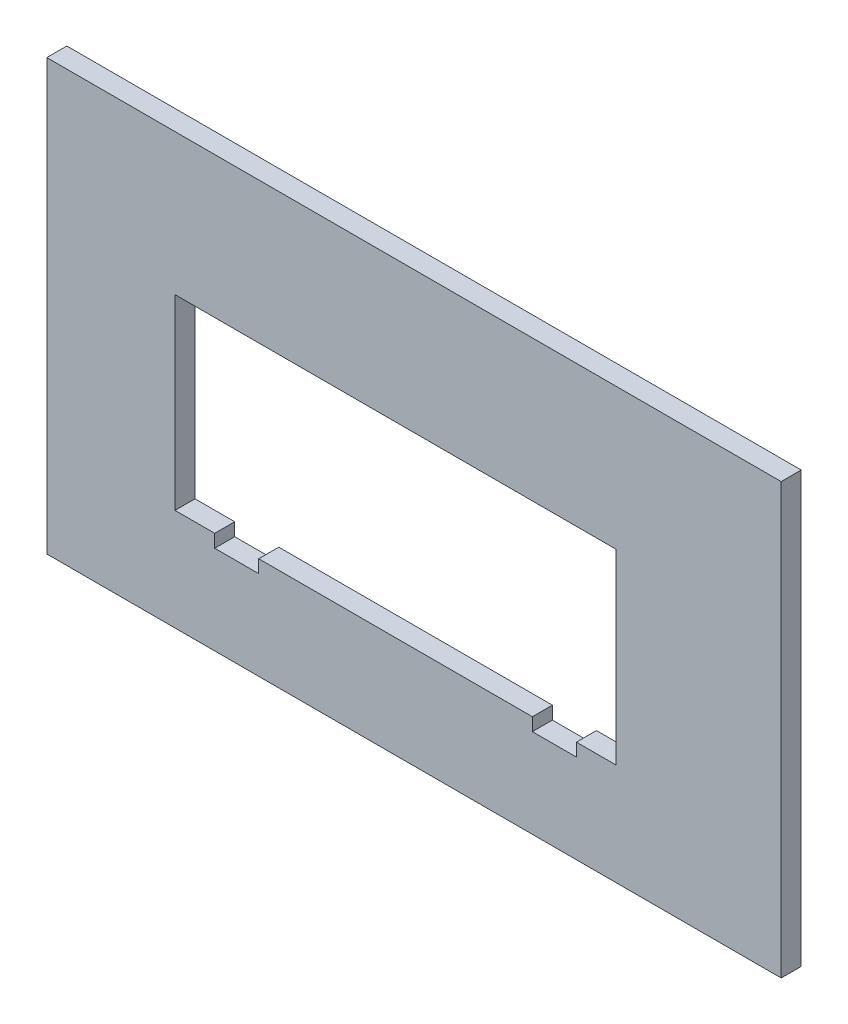
ISO-10303-21;
HEADER;
FILE_DESCRIPTION(('STEP AP214'),'2;1');
FILE_NAME('part.step','',(''),(''),'','','');
FILE_SCHEMA(('AUTOMOTIVE_DESIGN { 1 0 10303 214 1 1 1 1 }'));
ENDSEC;
DATA;
#1=APPLICATION_CONTEXT('core data for automotive mechanical design processes');
#2=APPLICATION_PROTOCOL_DEFINITION('international standard','automotive_design',2000,#1);
#3=PRODUCT_CONTEXT('',#1,'mechanical');
#4=PRODUCT('Part','Part','',(#3));
#5=PRODUCT_RELATED_PRODUCT_CATEGORY('part','',(#4));
#6=PRODUCT_DEFINITION_FORMATION('','',#4);
#7=PRODUCT_DEFINITION_CONTEXT('part definition',#1,'design');
#8=PRODUCT_DEFINITION('design','',#6,#7);
#9=PRODUCT_DEFINITION_SHAPE('','',#8);
#10=(LENGTH_UNIT() NAMED_UNIT(*) SI_UNIT(.MILLI.,.METRE.));
#11=(NAMED_UNIT(*) PLANE_ANGLE_UNIT() SI_UNIT($,.RADIAN.));
#12=(NAMED_UNIT(*) SI_UNIT($,.STERADIAN.) SOLID_ANGLE_UNIT());
#13=UNCERTAINTY_MEASURE_WITH_UNIT(LENGTH_MEASURE(1.E-05),#10,'distance_accuracy_value','');
#14=(GEOMETRIC_REPRESENTATION_CONTEXT(3) GLOBAL_UNCERTAINTY_ASSIGNED_CONTEXT((#13)) GLOBAL_UNIT_ASSIGNED_CONTEXT((#10,
#11,#12)) REPRESENTATION_CONTEXT('',''));
#15=CARTESIAN_POINT('',(0.,0.,0.));
#16=DIRECTION('',(0.,0.,1.));
#17=DIRECTION('',(1.,0.,0.));
#18=AXIS2_PLACEMENT_3D('',#15,#16,#17);
#19=CARTESIAN_POINT('',(0.,75.4547324301416,0.));
#20=DIRECTION('',(0.,-1.,0.));
#21=DIRECTION('',(0.,0.,-1.));
#22=AXIS2_PLACEMENT_3D('',#19,#20,#21);
#23=PLANE('',#22);
#24=DIRECTION('',(1.,0.,0.));
#25=VECTOR('',#24,1.);
#26=CARTESIAN_POINT('',(0.,75.4547324301416,0.));
#27=LINE('',#26,#25);
#28=CARTESIAN_POINT('',(294.980807461405,75.4547324301416,0.));
#29=VERTEX_POINT('',#28);
#30=CARTESIAN_POINT('',(297.956988381274,75.4547324301416,0.));
#31=VERTEX_POINT('',#30);
#32=EDGE_CURVE('E217',#29,#31,#27,.T.);
#33=ORIENTED_EDGE('',*,*,#32,.F.);
#34=DIRECTION('',(0.,0.,1.));
#35=VECTOR('',#34,1.);
#36=CARTESIAN_POINT('',(294.980807461405,75.4547324301416,0.));
#37=LINE('',#36,#35);
#38=CARTESIAN_POINT('',(294.980807461405,75.4547324301416,1.5));
#39=VERTEX_POINT('',#38);
#40=EDGE_CURVE('E266',#29,#39,#37,.T.);
#41=ORIENTED_EDGE('',*,*,#40,.T.);
#42=DIRECTION('',(1.,0.,0.));
#43=VECTOR('',#42,1.);
#44=CARTESIAN_POINT('',(0.,75.4547324301416,1.5));
#45=LINE('',#44,#43);
#46=CARTESIAN_POINT('',(297.956988381274,75.4547324301416,1.5));
#47=VERTEX_POINT('',#46);
#48=EDGE_CURVE('E193',#39,#47,#45,.T.);
#49=ORIENTED_EDGE('',*,*,#48,.T.);
#50=DIRECTION('',(0.,0.,1.));
#51=VECTOR('',#50,1.);
#52=CARTESIAN_POINT('',(297.956988381274,75.4547324301416,0.));
#53=LINE('',#52,#51);
#54=EDGE_CURVE('E220',#31,#47,#53,.T.);
#55=ORIENTED_EDGE('',*,*,#54,.F.);
#56=EDGE_LOOP('',(#33,#41,#49,#55));
#57=FACE_BOUND('',#56,.T.);
#58=ADVANCED_FACE('F33',(#57),#23,.F.);
#59=CARTESIAN_POINT('',(0.,0.,1.5));
#60=DIRECTION('',(0.,0.,1.));
#61=DIRECTION('',(1.,0.,0.));
#62=AXIS2_PLACEMENT_3D('',#59,#60,#61);
#63=PLANE('',#62);
#64=DIRECTION('',(1.,0.,0.));
#65=VECTOR('',#64,1.);
#66=CARTESIAN_POINT('',(0.,89.4547324301416,1.5));
#67=LINE('',#66,#65);
#68=CARTESIAN_POINT('',(264.905830275258,89.4547324301416,1.5));
#69=VERTEX_POINT('',#68);
#70=CARTESIAN_POINT('',(297.956988381274,89.4547324301416,1.5));
#71=VERTEX_POINT('',#70);
#72=EDGE_CURVE('E204',#69,#71,#67,.T.);
#73=ORIENTED_EDGE('',*,*,#72,.T.);
#74=DIRECTION('',(0.,-1.,0.));
#75=VECTOR('',#74,1.);
#76=CARTESIAN_POINT('',(297.956988381274,0.,1.5));
#77=LINE('',#76,#75);
#78=EDGE_CURVE('E223',#71,#47,#77,.T.);
#79=ORIENTED_EDGE('',*,*,#78,.T.);
#80=ORIENTED_EDGE('',*,*,#48,.F.);
#81=DIRECTION('',(0.,1.,0.));
#82=VECTOR('',#81,1.);
#83=CARTESIAN_POINT('',(294.980807461405,0.,1.5));
#84=LINE('',#83,#82);
#85=CARTESIAN_POINT('',(294.980807461405,74.4845734548846,1.5));
#86=VERTEX_POINT('',#85);
#87=EDGE_CURVE('E156',#86,#39,#84,.T.);
#88=ORIENTED_EDGE('',*,*,#87,.F.);
#89=DIRECTION('',(1.,0.,0.));
#90=VECTOR('',#89,1.);
#91=CARTESIAN_POINT('',(0.,74.4845734548846,1.5));
#92=LINE('',#91,#90);
#93=CARTESIAN_POINT('',(291.680606844615,74.4845734548846,1.5));
#94=VERTEX_POINT('',#93);
#95=EDGE_CURVE('E176',#94,#86,#92,.T.);
#96=ORIENTED_EDGE('',*,*,#95,.F.);
#97=DIRECTION('',(0.,-1.,0.));
#98=VECTOR('',#97,1.);
#99=CARTESIAN_POINT('',(291.680606844615,0.,1.5));
#100=LINE('',#99,#98);
#101=CARTESIAN_POINT('',(291.680606844615,75.4547324301416,1.5));
#102=VERTEX_POINT('',#101);
#103=EDGE_CURVE('E171',#102,#94,#100,.T.);
#104=ORIENTED_EDGE('',*,*,#103,.F.);
#105=CARTESIAN_POINT('',(271.180211690331,75.4547324301416,1.5));
#106=VERTEX_POINT('',#105);
#107=EDGE_CURVE('E221',#106,#102,#45,.T.);
#108=ORIENTED_EDGE('',*,*,#107,.F.);
#109=DIRECTION('',(0.,1.,0.));
#110=VECTOR('',#109,1.);
#111=CARTESIAN_POINT('',(271.180211690331,0.,1.5));
#112=LINE('',#111,#110);
#113=CARTESIAN_POINT('',(271.180211690331,74.4845734548846,1.5));
#114=VERTEX_POINT('',#113);
#115=EDGE_CURVE('E169',#114,#106,#112,.T.);
#116=ORIENTED_EDGE('',*,*,#115,.F.);
#117=DIRECTION('',(1.,0.,0.));
#118=VECTOR('',#117,1.);
#119=CARTESIAN_POINT('',(0.,74.4845734548846,1.5));
#120=LINE('',#119,#118);
#121=CARTESIAN_POINT('',(267.880011073541,74.4845734548846,1.5));
#122=VERTEX_POINT('',#121);
#123=EDGE_CURVE('E152',#122,#114,#120,.T.);
#124=ORIENTED_EDGE('',*,*,#123,.F.);
#125=DIRECTION('',(0.,-1.,0.));
#126=VECTOR('',#125,1.);
#127=CARTESIAN_POINT('',(267.880011073541,0.,1.5));
#128=LINE('',#127,#126);
#129=CARTESIAN_POINT('',(267.880011073541,75.4547324301416,1.5));
#130=VERTEX_POINT('',#129);
#131=EDGE_CURVE('E159',#130,#122,#128,.T.);
#132=ORIENTED_EDGE('',*,*,#131,.F.);
#133=DIRECTION('',(1.,0.,0.));
#134=VECTOR('',#133,1.);
#135=CARTESIAN_POINT('',(0.,75.4547324301416,1.5));
#136=LINE('',#135,#134);
#137=CARTESIAN_POINT('',(264.905830275258,75.4547324301416,1.5));
#138=VERTEX_POINT('',#137);
#139=EDGE_CURVE('E197',#138,#130,#136,.T.);
#140=ORIENTED_EDGE('',*,*,#139,.F.);
#141=DIRECTION('',(0.,-1.,0.));
#142=VECTOR('',#141,1.);
#143=CARTESIAN_POINT('',(264.905830275258,0.,1.5));
#144=LINE('',#143,#142);
#145=EDGE_CURVE('E206',#69,#138,#144,.T.);
#146=ORIENTED_EDGE('',*,*,#145,.F.);
#147=EDGE_LOOP('',(#73,#79,#80,#88,#96,#104,#108,#116,#124,#132,#140,#146));
#148=FACE_BOUND('',#147,.T.);
#149=DIRECTION('',(0.,-1.,0.));
#150=VECTOR('',#149,1.);
#151=CARTESIAN_POINT('',(255.29939967157,100.032463397683,1.5));
#152=LINE('',#151,#150);
#153=CARTESIAN_POINT('',(255.29939967157,100.032463397683,1.5));
#154=VERTEX_POINT('',#153);
#155=CARTESIAN_POINT('',(255.29939967157,67.8221295245159,1.5));
#156=VERTEX_POINT('',#155);
#157=EDGE_CURVE('E230',#154,#156,#152,.T.);
#158=ORIENTED_EDGE('',*,*,#157,.T.);
#159=DIRECTION('',(1.,0.,0.));
#160=VECTOR('',#159,1.);
#161=CARTESIAN_POINT('',(255.29939967157,67.8221295245159,1.5));
#162=LINE('',#161,#160);
#163=CARTESIAN_POINT('',(310.323438813396,67.8221295245159,1.5));
#164=VERTEX_POINT('',#163);
#165=EDGE_CURVE('E233',#156,#164,#162,.T.);
#166=ORIENTED_EDGE('',*,*,#165,.T.);
#167=DIRECTION('',(0.,1.,0.));
#168=VECTOR('',#167,1.);
#169=CARTESIAN_POINT('',(310.323438813396,100.032463397683,1.5));
#170=LINE('',#169,#168);
#171=CARTESIAN_POINT('',(310.323438813396,100.032463397683,1.5));
#172=VERTEX_POINT('',#171);
#173=EDGE_CURVE('E236',#164,#172,#170,.T.);
#174=ORIENTED_EDGE('',*,*,#173,.T.);
#175=DIRECTION('',(-1.,0.,0.));
#176=VECTOR('',#175,1.);
#177=CARTESIAN_POINT('',(255.29939967157,100.032463397683,1.5));
#178=LINE('',#177,#176);
#179=EDGE_CURVE('E238',#172,#154,#178,.T.);
#180=ORIENTED_EDGE('',*,*,#179,.T.);
#181=EDGE_LOOP('',(#158,#166,#174,#180));
#182=FACE_BOUND('',#181,.T.);
#183=ADVANCED_FACE('F166',(#148,#182),#63,.T.);
#184=CARTESIAN_POINT('',(0.,0.,0.));
#185=DIRECTION('',(0.,0.,1.));
#186=DIRECTION('',(1.,0.,0.));
#187=AXIS2_PLACEMENT_3D('',#184,#185,#186);
#188=PLANE('',#187);
#189=DIRECTION('',(0.,-1.,0.));
#190=VECTOR('',#189,1.);
#191=CARTESIAN_POINT('',(255.29939967157,100.032463397683,0.));
#192=LINE('',#191,#190);
#193=CARTESIAN_POINT('',(255.29939967157,100.032463397683,0.));
#194=VERTEX_POINT('',#193);
#195=CARTESIAN_POINT('',(255.29939967157,67.8221295245159,0.));
#196=VERTEX_POINT('',#195);
#197=EDGE_CURVE('E213',#194,#196,#192,.T.);
#198=ORIENTED_EDGE('',*,*,#197,.F.);
#199=DIRECTION('',(-1.,0.,0.));
#200=VECTOR('',#199,1.);
#201=CARTESIAN_POINT('',(255.29939967157,100.032463397683,0.));
#202=LINE('',#201,#200);
#203=CARTESIAN_POINT('',(310.323438813396,100.032463397683,0.));
#204=VERTEX_POINT('',#203);
#205=EDGE_CURVE('E234',#204,#194,#202,.T.);
#206=ORIENTED_EDGE('',*,*,#205,.F.);
#207=DIRECTION('',(0.,1.,0.));
#208=VECTOR('',#207,1.);
#209=CARTESIAN_POINT('',(310.323438813396,100.032463397683,0.));
#210=LINE('',#209,#208);
#211=CARTESIAN_POINT('',(310.323438813396,67.8221295245159,0.));
#212=VERTEX_POINT('',#211);
#213=EDGE_CURVE('E245',#212,#204,#210,.T.);
#214=ORIENTED_EDGE('',*,*,#213,.F.);
#215=DIRECTION('',(1.,0.,0.));
#216=VECTOR('',#215,1.);
#217=CARTESIAN_POINT('',(255.29939967157,67.8221295245159,0.));
#218=LINE('',#217,#216);
#219=EDGE_CURVE('E243',#196,#212,#218,.T.);
#220=ORIENTED_EDGE('',*,*,#219,.F.);
#221=EDGE_LOOP('',(#198,#206,#214,#220));
#222=FACE_BOUND('',#221,.T.);
#223=DIRECTION('',(0.,-1.,0.));
#224=VECTOR('',#223,1.);
#225=CARTESIAN_POINT('',(297.956988381274,0.,0.));
#226=LINE('',#225,#224);
#227=CARTESIAN_POINT('',(297.956988381274,89.4547324301416,0.));
#228=VERTEX_POINT('',#227);
#229=EDGE_CURVE('E216',#228,#31,#226,.T.);
#230=ORIENTED_EDGE('',*,*,#229,.F.);
#231=DIRECTION('',(1.,0.,0.));
#232=VECTOR('',#231,1.);
#233=CARTESIAN_POINT('',(0.,89.4547324301416,0.));
#234=LINE('',#233,#232);
#235=CARTESIAN_POINT('',(264.905830275258,89.4547324301416,0.));
#236=VERTEX_POINT('',#235);
#237=EDGE_CURVE('E194',#236,#228,#234,.T.);
#238=ORIENTED_EDGE('',*,*,#237,.F.);
#239=DIRECTION('',(0.,-1.,0.));
#240=VECTOR('',#239,1.);
#241=CARTESIAN_POINT('',(264.905830275258,0.,0.));
#242=LINE('',#241,#240);
#243=CARTESIAN_POINT('',(264.905830275258,75.4547324301416,0.));
#244=VERTEX_POINT('',#243);
#245=EDGE_CURVE('E196',#236,#244,#242,.T.);
#246=ORIENTED_EDGE('',*,*,#245,.T.);
#247=DIRECTION('',(1.,0.,0.));
#248=VECTOR('',#247,1.);
#249=CARTESIAN_POINT('',(0.,75.4547324301416,0.));
#250=LINE('',#249,#248);
#251=CARTESIAN_POINT('',(267.880011073541,75.4547324301416,0.));
#252=VERTEX_POINT('',#251);
#253=EDGE_CURVE('E200',#244,#252,#250,.T.);
#254=ORIENTED_EDGE('',*,*,#253,.T.);
#255=DIRECTION('',(0.,-1.,0.));
#256=VECTOR('',#255,1.);
#257=CARTESIAN_POINT('',(267.880011073541,0.,0.));
#258=LINE('',#257,#256);
#259=CARTESIAN_POINT('',(267.880011073541,74.4845734548846,0.));
#260=VERTEX_POINT('',#259);
#261=EDGE_CURVE('E56',#252,#260,#258,.T.);
#262=ORIENTED_EDGE('',*,*,#261,.T.);
#263=DIRECTION('',(1.,0.,0.));
#264=VECTOR('',#263,1.);
#265=CARTESIAN_POINT('',(0.,74.4845734548846,0.));
#266=LINE('',#265,#264);
#267=CARTESIAN_POINT('',(271.180211690331,74.4845734548846,0.));
#268=VERTEX_POINT('',#267);
#269=EDGE_CURVE('E41',#260,#268,#266,.T.);
#270=ORIENTED_EDGE('',*,*,#269,.T.);
#271=DIRECTION('',(0.,1.,0.));
#272=VECTOR('',#271,1.);
#273=CARTESIAN_POINT('',(271.180211690331,0.,0.));
#274=LINE('',#273,#272);
#275=CARTESIAN_POINT('',(271.180211690331,75.4547324301416,0.));
#276=VERTEX_POINT('',#275);
#277=EDGE_CURVE('E186',#268,#276,#274,.T.);
#278=ORIENTED_EDGE('',*,*,#277,.T.);
#279=CARTESIAN_POINT('',(291.680606844615,75.4547324301416,0.));
#280=VERTEX_POINT('',#279);
#281=EDGE_CURVE('E48',#276,#280,#27,.T.);
#282=ORIENTED_EDGE('',*,*,#281,.T.);
#283=DIRECTION('',(0.,-1.,0.));
#284=VECTOR('',#283,1.);
#285=CARTESIAN_POINT('',(291.680606844615,0.,0.));
#286=LINE('',#285,#284);
#287=CARTESIAN_POINT('',(291.680606844615,74.4845734548846,0.));
#288=VERTEX_POINT('',#287);
#289=EDGE_CURVE('E188',#280,#288,#286,.T.);
#290=ORIENTED_EDGE('',*,*,#289,.T.);
#291=DIRECTION('',(1.,0.,0.));
#292=VECTOR('',#291,1.);
#293=CARTESIAN_POINT('',(0.,74.4845734548846,0.));
#294=LINE('',#293,#292);
#295=CARTESIAN_POINT('',(294.980807461405,74.4845734548846,0.));
#296=VERTEX_POINT('',#295);
#297=EDGE_CURVE('E11',#288,#296,#294,.T.);
#298=ORIENTED_EDGE('',*,*,#297,.T.);
#299=DIRECTION('',(0.,1.,0.));
#300=VECTOR('',#299,1.);
#301=CARTESIAN_POINT('',(294.980807461405,0.,0.));
#302=LINE('',#301,#300);
#303=EDGE_CURVE('E190',#296,#29,#302,.T.);
#304=ORIENTED_EDGE('',*,*,#303,.T.);
#305=ORIENTED_EDGE('',*,*,#32,.T.);
#306=EDGE_LOOP('',(#230,#238,#246,#254,#262,#270,#278,#282,#290,#298,#304,#305));
#307=FACE_BOUND('',#306,.T.);
#308=ADVANCED_FACE('F269',(#222,#307),#188,.F.);
#309=CARTESIAN_POINT('',(255.29939967157,100.032463397683,1.5));
#310=DIRECTION('',(1.,0.,0.));
#311=DIRECTION('',(0.,0.,-1.));
#312=AXIS2_PLACEMENT_3D('',#309,#310,#311);
#313=PLANE('',#312);
#314=ORIENTED_EDGE('',*,*,#197,.T.);
#315=DIRECTION('',(0.,0.,-1.));
#316=VECTOR('',#315,1.);
#317=CARTESIAN_POINT('',(255.29939967157,67.8221295245159,1.5));
#318=LINE('',#317,#316);
#319=EDGE_CURVE('E256',#156,#196,#318,.T.);
#320=ORIENTED_EDGE('',*,*,#319,.F.);
#321=ORIENTED_EDGE('',*,*,#157,.F.);
#322=DIRECTION('',(0.,0.,-1.));
#323=VECTOR('',#322,1.);
#324=CARTESIAN_POINT('',(255.29939967157,100.032463397683,1.5));
#325=LINE('',#324,#323);
#326=EDGE_CURVE('E240',#154,#194,#325,.T.);
#327=ORIENTED_EDGE('',*,*,#326,.T.);
#328=EDGE_LOOP('',(#314,#320,#321,#327));
#329=FACE_BOUND('',#328,.T.);
#330=ADVANCED_FACE('F35',(#329),#313,.F.);
#331=CARTESIAN_POINT('',(255.29939967157,67.8221295245159,1.5));
#332=DIRECTION('',(0.,1.,0.));
#333=DIRECTION('',(0.,0.,1.));
#334=AXIS2_PLACEMENT_3D('',#331,#332,#333);
#335=PLANE('',#334);
#336=ORIENTED_EDGE('',*,*,#219,.T.);
#337=DIRECTION('',(0.,0.,-1.));
#338=VECTOR('',#337,1.);
#339=CARTESIAN_POINT('',(310.323438813396,67.8221295245159,1.5));
#340=LINE('',#339,#338);
#341=EDGE_CURVE('E253',#164,#212,#340,.T.);
#342=ORIENTED_EDGE('',*,*,#341,.F.);
#343=ORIENTED_EDGE('',*,*,#165,.F.);
#344=ORIENTED_EDGE('',*,*,#319,.T.);
#345=EDGE_LOOP('',(#336,#342,#343,#344));
#346=FACE_BOUND('',#345,.T.);
#347=ADVANCED_FACE('F333',(#346),#335,.F.);
#348=CARTESIAN_POINT('',(310.323438813396,100.032463397683,1.5));
#349=DIRECTION('',(-1.,0.,0.));
#350=DIRECTION('',(0.,0.,1.));
#351=AXIS2_PLACEMENT_3D('',#348,#349,#350);
#352=PLANE('',#351);
#353=ORIENTED_EDGE('',*,*,#213,.T.);
#354=DIRECTION('',(0.,0.,-1.));
#355=VECTOR('',#354,1.);
#356=CARTESIAN_POINT('',(310.323438813396,100.032463397683,1.5));
#357=LINE('',#356,#355);
#358=EDGE_CURVE('E250',#172,#204,#357,.T.);
#359=ORIENTED_EDGE('',*,*,#358,.F.);
#360=ORIENTED_EDGE('',*,*,#173,.F.);
#361=ORIENTED_EDGE('',*,*,#341,.T.);
#362=EDGE_LOOP('',(#353,#359,#360,#361));
#363=FACE_BOUND('',#362,.T.);
#364=ADVANCED_FACE('F330',(#363),#352,.F.);
#365=CARTESIAN_POINT('',(255.29939967157,100.032463397683,1.5));
#366=DIRECTION('',(0.,-1.,0.));
#367=DIRECTION('',(0.,0.,-1.));
#368=AXIS2_PLACEMENT_3D('',#365,#366,#367);
#369=PLANE('',#368);
#370=ORIENTED_EDGE('',*,*,#205,.T.);
#371=ORIENTED_EDGE('',*,*,#326,.F.);
#372=ORIENTED_EDGE('',*,*,#179,.F.);
#373=ORIENTED_EDGE('',*,*,#358,.T.);
#374=EDGE_LOOP('',(#370,#371,#372,#373));
#375=FACE_BOUND('',#374,.T.);
#376=ADVANCED_FACE('F312',(#375),#369,.F.);
#377=CARTESIAN_POINT('',(297.956988381274,0.,0.));
#378=DIRECTION('',(-1.,0.,0.));
#379=DIRECTION('',(0.,0.,1.));
#380=AXIS2_PLACEMENT_3D('',#377,#378,#379);
#381=PLANE('',#380);
#382=ORIENTED_EDGE('',*,*,#78,.F.);
#383=DIRECTION('',(0.,0.,1.));
#384=VECTOR('',#383,1.);
#385=CARTESIAN_POINT('',(297.956988381274,89.4547324301416,0.));
#386=LINE('',#385,#384);
#387=EDGE_CURVE('E207',#228,#71,#386,.T.);
#388=ORIENTED_EDGE('',*,*,#387,.F.);
#389=ORIENTED_EDGE('',*,*,#229,.T.);
#390=ORIENTED_EDGE('',*,*,#54,.T.);
#391=EDGE_LOOP('',(#382,#388,#389,#390));
#392=FACE_BOUND('',#391,.T.);
#393=ADVANCED_FACE('F284',(#392),#381,.T.);
#394=ORIENTED_EDGE('',*,*,#107,.T.);
#395=DIRECTION('',(0.,0.,-1.));
#396=VECTOR('',#395,1.);
#397=CARTESIAN_POINT('',(291.680606844615,75.4547324301416,0.));
#398=LINE('',#397,#396);
#399=EDGE_CURVE('E263',#102,#280,#398,.T.);
#400=ORIENTED_EDGE('',*,*,#399,.T.);
#401=ORIENTED_EDGE('',*,*,#281,.F.);
#402=DIRECTION('',(0.,0.,1.));
#403=VECTOR('',#402,1.);
#404=CARTESIAN_POINT('',(271.180211690331,75.4547324301416,0.));
#405=LINE('',#404,#403);
#406=EDGE_CURVE('E260',#276,#106,#405,.T.);
#407=ORIENTED_EDGE('',*,*,#406,.T.);
#408=EDGE_LOOP('',(#394,#400,#401,#407));
#409=FACE_BOUND('',#408,.T.);
#410=ADVANCED_FACE('F305',(#409),#23,.F.);
#411=ORIENTED_EDGE('',*,*,#139,.T.);
#412=DIRECTION('',(0.,0.,-1.));
#413=VECTOR('',#412,1.);
#414=CARTESIAN_POINT('',(267.880011073541,75.4547324301416,0.));
#415=LINE('',#414,#413);
#416=EDGE_CURVE('E161',#130,#252,#415,.T.);
#417=ORIENTED_EDGE('',*,*,#416,.T.);
#418=ORIENTED_EDGE('',*,*,#253,.F.);
#419=DIRECTION('',(0.,0.,1.));
#420=VECTOR('',#419,1.);
#421=CARTESIAN_POINT('',(264.905830275258,75.4547324301416,0.));
#422=LINE('',#421,#420);
#423=EDGE_CURVE('E211',#244,#138,#422,.T.);
#424=ORIENTED_EDGE('',*,*,#423,.T.);
#425=EDGE_LOOP('',(#411,#417,#418,#424));
#426=FACE_BOUND('',#425,.T.);
#427=ADVANCED_FACE('F273',(#426),#23,.F.);
#428=CARTESIAN_POINT('',(264.905830275258,0.,0.));
#429=DIRECTION('',(-1.,0.,0.));
#430=DIRECTION('',(0.,0.,1.));
#431=AXIS2_PLACEMENT_3D('',#428,#429,#430);
#432=PLANE('',#431);
#433=ORIENTED_EDGE('',*,*,#145,.T.);
#434=ORIENTED_EDGE('',*,*,#423,.F.);
#435=ORIENTED_EDGE('',*,*,#245,.F.);
#436=DIRECTION('',(0.,0.,1.));
#437=VECTOR('',#436,1.);
#438=CARTESIAN_POINT('',(264.905830275258,89.4547324301416,0.));
#439=LINE('',#438,#437);
#440=EDGE_CURVE('E203',#236,#69,#439,.T.);
#441=ORIENTED_EDGE('',*,*,#440,.T.);
#442=EDGE_LOOP('',(#433,#434,#435,#441));
#443=FACE_BOUND('',#442,.T.);
#444=ADVANCED_FACE('F278',(#443),#432,.F.);
#445=CARTESIAN_POINT('',(0.,89.4547324301416,0.));
#446=DIRECTION('',(0.,-1.,0.));
#447=DIRECTION('',(0.,0.,-1.));
#448=AXIS2_PLACEMENT_3D('',#445,#446,#447);
#449=PLANE('',#448);
#450=ORIENTED_EDGE('',*,*,#237,.T.);
#451=ORIENTED_EDGE('',*,*,#387,.T.);
#452=ORIENTED_EDGE('',*,*,#72,.F.);
#453=ORIENTED_EDGE('',*,*,#440,.F.);
#454=EDGE_LOOP('',(#450,#451,#452,#453));
#455=FACE_BOUND('',#454,.T.);
#456=ADVANCED_FACE('F281',(#455),#449,.T.);
#457=CARTESIAN_POINT('',(271.180211690331,0.,-1.2E-05));
#458=DIRECTION('',(1.,0.,0.));
#459=DIRECTION('',(0.,0.,-1.));
#460=AXIS2_PLACEMENT_3D('',#457,#458,#459);
#461=PLANE('',#460);
#462=DIRECTION('',(0.,0.,1.));
#463=VECTOR('',#462,1.);
#464=CARTESIAN_POINT('',(271.180211690331,74.4845734548846,-1.2E-05));
#465=LINE('',#464,#463);
#466=EDGE_CURVE('E155',#268,#114,#465,.T.);
#467=ORIENTED_EDGE('',*,*,#466,.T.);
#468=ORIENTED_EDGE('',*,*,#115,.T.);
#469=ORIENTED_EDGE('',*,*,#406,.F.);
#470=ORIENTED_EDGE('',*,*,#277,.F.);
#471=EDGE_LOOP('',(#467,#468,#469,#470));
#472=FACE_BOUND('',#471,.T.);
#473=ADVANCED_FACE('F304',(#472),#461,.F.);
#474=CARTESIAN_POINT('',(267.880011073541,0.,-1.2E-05));
#475=DIRECTION('',(-1.,0.,0.));
#476=DIRECTION('',(0.,0.,1.));
#477=AXIS2_PLACEMENT_3D('',#474,#475,#476);
#478=PLANE('',#477);
#479=ORIENTED_EDGE('',*,*,#416,.F.);
#480=ORIENTED_EDGE('',*,*,#131,.T.);
#481=DIRECTION('',(0.,0.,1.));
#482=VECTOR('',#481,1.);
#483=CARTESIAN_POINT('',(267.880011073541,74.4845734548846,-1.2E-05));
#484=LINE('',#483,#482);
#485=EDGE_CURVE('E147',#260,#122,#484,.T.);
#486=ORIENTED_EDGE('',*,*,#485,.F.);
#487=ORIENTED_EDGE('',*,*,#261,.F.);
#488=EDGE_LOOP('',(#479,#480,#486,#487));
#489=FACE_BOUND('',#488,.T.);
#490=ADVANCED_FACE('F160',(#489),#478,.F.);
#491=CARTESIAN_POINT('',(0.,74.4845734548846,-1.2E-05));
#492=DIRECTION('',(0.,-1.,0.));
#493=DIRECTION('',(0.,0.,-1.));
#494=AXIS2_PLACEMENT_3D('',#491,#492,#493);
#495=PLANE('',#494);
#496=ORIENTED_EDGE('',*,*,#485,.T.);
#497=ORIENTED_EDGE('',*,*,#123,.T.);
#498=ORIENTED_EDGE('',*,*,#466,.F.);
#499=ORIENTED_EDGE('',*,*,#269,.F.);
#500=EDGE_LOOP('',(#496,#497,#498,#499));
#501=FACE_BOUND('',#500,.T.);
#502=ADVANCED_FACE('F149',(#501),#495,.F.);
#503=CARTESIAN_POINT('',(0.,74.4845734548846,-1.2E-05));
#504=DIRECTION('',(0.,-1.,0.));
#505=DIRECTION('',(0.,0.,-1.));
#506=AXIS2_PLACEMENT_3D('',#503,#504,#505);
#507=PLANE('',#506);
#508=DIRECTION('',(0.,0.,1.));
#509=VECTOR('',#508,1.);
#510=CARTESIAN_POINT('',(291.680606844615,74.4845734548846,-1.2E-05));
#511=LINE('',#510,#509);
#512=EDGE_CURVE('E182',#288,#94,#511,.T.);
#513=ORIENTED_EDGE('',*,*,#512,.T.);
#514=ORIENTED_EDGE('',*,*,#95,.T.);
#515=DIRECTION('',(0.,0.,1.));
#516=VECTOR('',#515,1.);
#517=CARTESIAN_POINT('',(294.980807461405,74.4845734548846,-1.2E-05));
#518=LINE('',#517,#516);
#519=EDGE_CURVE('E180',#296,#86,#518,.T.);
#520=ORIENTED_EDGE('',*,*,#519,.F.);
#521=ORIENTED_EDGE('',*,*,#297,.F.);
#522=EDGE_LOOP('',(#513,#514,#520,#521));
#523=FACE_BOUND('',#522,.T.);
#524=ADVANCED_FACE('F296',(#523),#507,.F.);
#525=CARTESIAN_POINT('',(294.980807461405,0.,-1.2E-05));
#526=DIRECTION('',(1.,0.,0.));
#527=DIRECTION('',(0.,0.,-1.));
#528=AXIS2_PLACEMENT_3D('',#525,#526,#527);
#529=PLANE('',#528);
#530=ORIENTED_EDGE('',*,*,#519,.T.);
#531=ORIENTED_EDGE('',*,*,#87,.T.);
#532=ORIENTED_EDGE('',*,*,#40,.F.);
#533=ORIENTED_EDGE('',*,*,#303,.F.);
#534=EDGE_LOOP('',(#530,#531,#532,#533));
#535=FACE_BOUND('',#534,.T.);
#536=ADVANCED_FACE('F293',(#535),#529,.F.);
#537=CARTESIAN_POINT('',(291.680606844615,0.,-1.2E-05));
#538=DIRECTION('',(-1.,0.,0.));
#539=DIRECTION('',(0.,0.,1.));
#540=AXIS2_PLACEMENT_3D('',#537,#538,#539);
#541=PLANE('',#540);
#542=ORIENTED_EDGE('',*,*,#399,.F.);
#543=ORIENTED_EDGE('',*,*,#103,.T.);
#544=ORIENTED_EDGE('',*,*,#512,.F.);
#545=ORIENTED_EDGE('',*,*,#289,.F.);
#546=EDGE_LOOP('',(#542,#543,#544,#545));
#547=FACE_BOUND('',#546,.T.);
#548=ADVANCED_FACE('F300',(#547),#541,.F.);
#549=CLOSED_SHELL('',(#58,#183,#308,#330,#347,#364,#376,#393,#410,#427,#444,#456,#473,#490,#502,
#524,#536,#548));
#550=MANIFOLD_SOLID_BREP('B2',#549);
#551=ADVANCED_BREP_SHAPE_REPRESENTATION('',(#18,#550),#14);
#552=SHAPE_DEFINITION_REPRESENTATION(#9,#551);
ENDSEC;
END-ISO-10303-21;
